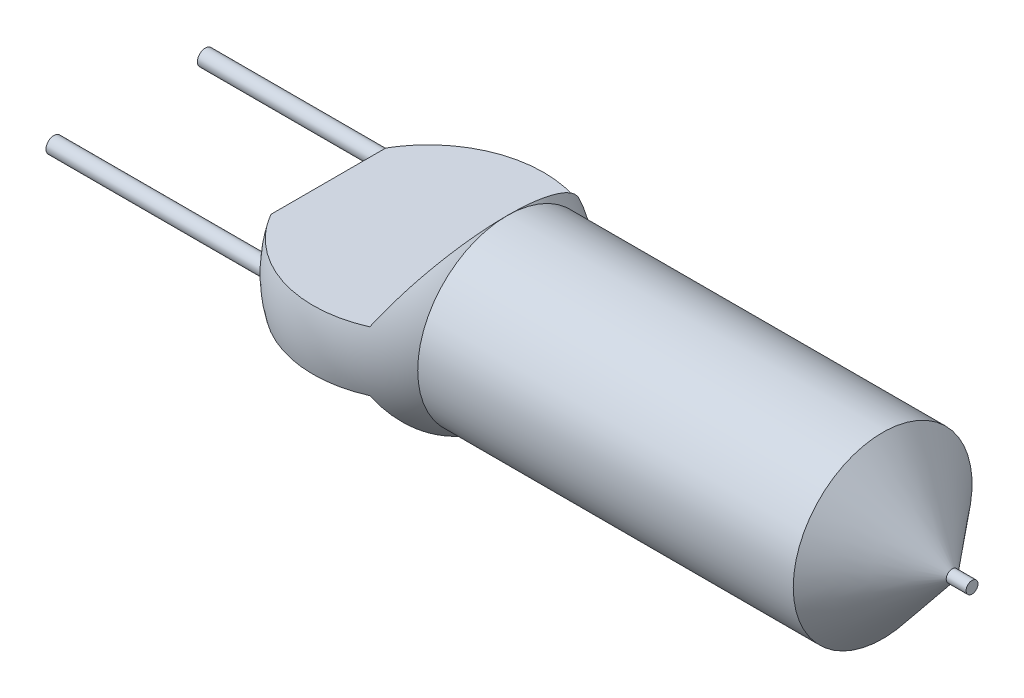
ISO-10303-21;
HEADER;
FILE_DESCRIPTION(('STEP AP214'),'2;1');
FILE_NAME('part.step','',(''),(''),'','','');
FILE_SCHEMA(('AUTOMOTIVE_DESIGN { 1 0 10303 214 1 1 1 1 }'));
ENDSEC;
DATA;
#1=APPLICATION_CONTEXT('core data for automotive mechanical design processes');
#2=APPLICATION_PROTOCOL_DEFINITION('international standard','automotive_design',2000,#1);
#3=PRODUCT_CONTEXT('',#1,'mechanical');
#4=PRODUCT('Part','Part','',(#3));
#5=PRODUCT_RELATED_PRODUCT_CATEGORY('part','',(#4));
#6=PRODUCT_DEFINITION_FORMATION('','',#4);
#7=PRODUCT_DEFINITION_CONTEXT('part definition',#1,'design');
#8=PRODUCT_DEFINITION('design','',#6,#7);
#9=PRODUCT_DEFINITION_SHAPE('','',#8);
#10=(LENGTH_UNIT() NAMED_UNIT(*) SI_UNIT(.MILLI.,.METRE.));
#11=(NAMED_UNIT(*) PLANE_ANGLE_UNIT() SI_UNIT($,.RADIAN.));
#12=(NAMED_UNIT(*) SI_UNIT($,.STERADIAN.) SOLID_ANGLE_UNIT());
#13=UNCERTAINTY_MEASURE_WITH_UNIT(LENGTH_MEASURE(1.E-05),#10,'distance_accuracy_value','');
#14=(GEOMETRIC_REPRESENTATION_CONTEXT(3) GLOBAL_UNCERTAINTY_ASSIGNED_CONTEXT((#13)) GLOBAL_UNIT_ASSIGNED_CONTEXT((#10,
#11,#12)) REPRESENTATION_CONTEXT('',''));
#15=CARTESIAN_POINT('',(0.,0.,0.));
#16=DIRECTION('',(0.,0.,1.));
#17=DIRECTION('',(1.,0.,0.));
#18=AXIS2_PLACEMENT_3D('',#15,#16,#17);
#19=CARTESIAN_POINT('',(4.,0.,3.81));
#20=DIRECTION('',(-1.,0.,0.));
#21=DIRECTION('',(0.,0.,1.));
#22=AXIS2_PLACEMENT_3D('',#19,#20,#21);
#23=CYLINDRICAL_SURFACE('',#22,0.4);
#24=CARTESIAN_POINT('',(4.,0.,3.81));
#25=DIRECTION('',(-1.,0.,0.));
#26=DIRECTION('',(0.,0.,-1.));
#27=AXIS2_PLACEMENT_3D('',#24,#25,#26);
#28=CIRCLE('',#27,0.4);
#29=CARTESIAN_POINT('',(4.,0.,3.41));
#30=VERTEX_POINT('',#29);
#31=EDGE_CURVE('E11',#30,#30,#28,.T.);
#32=ORIENTED_EDGE('',*,*,#31,.T.);
#33=EDGE_LOOP('',(#32));
#34=FACE_BOUND('',#33,.T.);
#35=CARTESIAN_POINT('',(-10.,0.,3.81));
#36=DIRECTION('',(-1.,0.,0.));
#37=DIRECTION('',(0.,0.,-1.));
#38=AXIS2_PLACEMENT_3D('',#35,#36,#37);
#39=CIRCLE('',#38,0.4);
#40=CARTESIAN_POINT('',(-10.,0.,3.41));
#41=VERTEX_POINT('',#40);
#42=EDGE_CURVE('E47',#41,#41,#39,.T.);
#43=ORIENTED_EDGE('',*,*,#42,.F.);
#44=EDGE_LOOP('',(#43));
#45=FACE_BOUND('',#44,.T.);
#46=ADVANCED_FACE('F41',(#34,#45),#23,.T.);
#47=CARTESIAN_POINT('',(4.,0.,3.81));
#48=DIRECTION('',(1.,0.,0.));
#49=DIRECTION('',(0.,0.,-1.));
#50=AXIS2_PLACEMENT_3D('',#47,#48,#49);
#51=PLANE('',#50);
#52=ORIENTED_EDGE('',*,*,#31,.F.);
#53=EDGE_LOOP('',(#52));
#54=FACE_BOUND('',#53,.T.);
#55=ADVANCED_FACE('F56',(#54),#51,.T.);
#56=CARTESIAN_POINT('',(-10.,0.,3.81));
#57=DIRECTION('',(1.,0.,0.));
#58=DIRECTION('',(0.,0.,-1.));
#59=AXIS2_PLACEMENT_3D('',#56,#57,#58);
#60=PLANE('',#59);
#61=ORIENTED_EDGE('',*,*,#42,.T.);
#62=EDGE_LOOP('',(#61));
#63=FACE_BOUND('',#62,.T.);
#64=ADVANCED_FACE('F53',(#63),#60,.F.);
#65=CLOSED_SHELL('',(#46,#55,#64));
#66=MANIFOLD_SOLID_BREP('B2',#65);
#67=CARTESIAN_POINT('',(4.,0.,-3.81));
#68=DIRECTION('',(-1.,0.,0.));
#69=DIRECTION('',(0.,0.,1.));
#70=AXIS2_PLACEMENT_3D('',#67,#68,#69);
#71=CYLINDRICAL_SURFACE('',#70,0.4);
#72=CARTESIAN_POINT('',(4.,0.,-3.81));
#73=DIRECTION('',(-1.,0.,0.));
#74=DIRECTION('',(0.,0.,1.));
#75=AXIS2_PLACEMENT_3D('',#72,#73,#74);
#76=CIRCLE('',#75,0.4);
#77=CARTESIAN_POINT('',(4.,0.,-3.41));
#78=VERTEX_POINT('',#77);
#79=EDGE_CURVE('E40',#78,#78,#76,.T.);
#80=ORIENTED_EDGE('',*,*,#79,.T.);
#81=EDGE_LOOP('',(#80));
#82=FACE_BOUND('',#81,.T.);
#83=CARTESIAN_POINT('',(-10.,0.,-3.81));
#84=DIRECTION('',(-1.,0.,0.));
#85=DIRECTION('',(0.,0.,1.));
#86=AXIS2_PLACEMENT_3D('',#83,#84,#85);
#87=CIRCLE('',#86,0.4);
#88=CARTESIAN_POINT('',(-10.,0.,-3.41));
#89=VERTEX_POINT('',#88);
#90=EDGE_CURVE('E96',#89,#89,#87,.T.);
#91=ORIENTED_EDGE('',*,*,#90,.F.);
#92=EDGE_LOOP('',(#91));
#93=FACE_BOUND('',#92,.T.);
#94=ADVANCED_FACE('F90',(#82,#93),#71,.T.);
#95=CARTESIAN_POINT('',(4.,0.,-3.81));
#96=DIRECTION('',(-1.,0.,0.));
#97=DIRECTION('',(0.,0.,1.));
#98=AXIS2_PLACEMENT_3D('',#95,#96,#97);
#99=PLANE('',#98);
#100=ORIENTED_EDGE('',*,*,#79,.F.);
#101=EDGE_LOOP('',(#100));
#102=FACE_BOUND('',#101,.T.);
#103=ADVANCED_FACE('F105',(#102),#99,.F.);
#104=CARTESIAN_POINT('',(-10.,0.,-3.81));
#105=DIRECTION('',(-1.,0.,0.));
#106=DIRECTION('',(0.,0.,1.));
#107=AXIS2_PLACEMENT_3D('',#104,#105,#106);
#108=PLANE('',#107);
#109=ORIENTED_EDGE('',*,*,#90,.T.);
#110=EDGE_LOOP('',(#109));
#111=FACE_BOUND('',#110,.T.);
#112=ADVANCED_FACE('F102',(#111),#108,.T.);
#113=CLOSED_SHELL('',(#94,#103,#112));
#114=MANIFOLD_SOLID_BREP('B6',#113);
#115=CARTESIAN_POINT('',(0.,0.,0.));
#116=DIRECTION('',(1.,0.,0.));
#117=DIRECTION('',(0.,0.,-1.));
#118=AXIS2_PLACEMENT_3D('',#115,#116,#117);
#119=PLANE('',#118);
#120=DIRECTION('',(0.,0.,-1.));
#121=VECTOR('',#120,1.);
#122=CARTESIAN_POINT('',(0.,-1.5,0.));
#123=LINE('',#122,#121);
#124=CARTESIAN_POINT('',(0.,-1.5,2.8831406486677));
#125=VERTEX_POINT('',#124);
#126=CARTESIAN_POINT('',(0.,-1.5,-2.8831406486677));
#127=VERTEX_POINT('',#126);
#128=EDGE_CURVE('E143',#125,#127,#123,.T.);
#129=ORIENTED_EDGE('',*,*,#128,.F.);
#130=CARTESIAN_POINT('',(0.,0.,0.));
#131=DIRECTION('',(-1.,0.,0.));
#132=DIRECTION('',(0.,0.,1.));
#133=AXIS2_PLACEMENT_3D('',#130,#131,#132);
#134=CIRCLE('',#133,3.25);
#135=CARTESIAN_POINT('',(0.,1.5,2.8831406486677));
#136=VERTEX_POINT('',#135);
#137=EDGE_CURVE('E199',#125,#136,#134,.T.);
#138=ORIENTED_EDGE('',*,*,#137,.T.);
#139=DIRECTION('',(0.,0.,1.));
#140=VECTOR('',#139,1.);
#141=CARTESIAN_POINT('',(0.,1.5,0.));
#142=LINE('',#141,#140);
#143=CARTESIAN_POINT('',(0.,1.5,-2.8831406486677));
#144=VERTEX_POINT('',#143);
#145=EDGE_CURVE('E216',#144,#136,#142,.T.);
#146=ORIENTED_EDGE('',*,*,#145,.F.);
#147=EDGE_CURVE('E200',#144,#127,#134,.T.);
#148=ORIENTED_EDGE('',*,*,#147,.T.);
#149=EDGE_LOOP('',(#129,#138,#146,#148));
#150=FACE_BOUND('',#149,.T.);
#151=ADVANCED_FACE('F130',(#150),#119,.F.);
#152=CARTESIAN_POINT('',(5.03819444444444,0.,0.));
#153=DIRECTION('',(-1.,0.,0.));
#154=DIRECTION('',(0.,1.,0.));
#155=AXIS2_PLACEMENT_3D('',#152,#153,#154);
#156=SPHERICAL_SURFACE('',#155,5.99549024351061);
#157=CARTESIAN_POINT('',(5.03819444444444,-1.5,0.));
#158=DIRECTION('',(0.,-1.,0.));
#159=DIRECTION('',(1.,0.,0.));
#160=AXIS2_PLACEMENT_3D('',#157,#158,#159);
#161=CIRCLE('',#160,5.80481724604925);
#162=CARTESIAN_POINT('',(7.39156576262559,-1.5,5.30636850386337));
#163=VERTEX_POINT('',#162);
#164=EDGE_CURVE('E88',#163,#125,#161,.T.);
#165=ORIENTED_EDGE('',*,*,#164,.F.);
#166=CARTESIAN_POINT('',(6.24146662548246,0.645128057620573,0.));
#167=DIRECTION('',(-0.881322004928886,-0.472516162293025,0.));
#168=DIRECTION('',(0.472516162293025,-0.881322004928886,0.));
#169=AXIS2_PLACEMENT_3D('',#166,#167,#168);
#170=CIRCLE('',#169,5.83796617904229);
#171=CARTESIAN_POINT('',(8.99999999999999,-4.5,0.));
#172=VERTEX_POINT('',#171);
#173=EDGE_CURVE('E179',#172,#163,#170,.T.);
#174=ORIENTED_EDGE('',*,*,#173,.F.);
#175=CARTESIAN_POINT('',(8.99999999999999,0.,0.));
#176=DIRECTION('',(-1.,0.,0.));
#177=DIRECTION('',(0.,0.,1.));
#178=AXIS2_PLACEMENT_3D('',#175,#176,#177);
#179=CIRCLE('',#178,4.5);
#180=CARTESIAN_POINT('',(8.99999999999999,4.5,0.));
#181=VERTEX_POINT('',#180);
#182=EDGE_CURVE('E151',#172,#181,#179,.T.);
#183=ORIENTED_EDGE('',*,*,#182,.T.);
#184=CARTESIAN_POINT('',(6.24146662548246,-0.645128057620574,0.));
#185=DIRECTION('',(-0.881322004928886,0.472516162293025,0.));
#186=DIRECTION('',(-0.472516162293025,-0.881322004928886,0.));
#187=AXIS2_PLACEMENT_3D('',#184,#185,#186);
#188=CIRCLE('',#187,5.83796617904229);
#189=CARTESIAN_POINT('',(7.39156576262559,1.5,5.30636850386337));
#190=VERTEX_POINT('',#189);
#191=EDGE_CURVE('E218',#190,#181,#188,.T.);
#192=ORIENTED_EDGE('',*,*,#191,.F.);
#193=CARTESIAN_POINT('',(5.03819444444444,1.5,0.));
#194=DIRECTION('',(0.,1.,0.));
#195=DIRECTION('',(-1.,0.,0.));
#196=AXIS2_PLACEMENT_3D('',#193,#194,#195);
#197=CIRCLE('',#196,5.80481724604925);
#198=EDGE_CURVE('E206',#136,#190,#197,.T.);
#199=ORIENTED_EDGE('',*,*,#198,.F.);
#200=ORIENTED_EDGE('',*,*,#137,.F.);
#201=EDGE_LOOP('',(#165,#174,#183,#192,#199,#200));
#202=FACE_BOUND('',#201,.T.);
#203=ADVANCED_FACE('F186',(#202),#156,.T.);
#204=CARTESIAN_POINT('',(7.39156576262559,-1.5,-5.30636850386337));
#205=VERTEX_POINT('',#204);
#206=EDGE_CURVE('E177',#205,#172,#170,.T.);
#207=ORIENTED_EDGE('',*,*,#206,.F.);
#208=EDGE_CURVE('E133',#127,#205,#161,.T.);
#209=ORIENTED_EDGE('',*,*,#208,.F.);
#210=ORIENTED_EDGE('',*,*,#147,.F.);
#211=CARTESIAN_POINT('',(7.39156576262559,1.5,-5.30636850386337));
#212=VERTEX_POINT('',#211);
#213=EDGE_CURVE('E205',#212,#144,#197,.T.);
#214=ORIENTED_EDGE('',*,*,#213,.F.);
#215=EDGE_CURVE('E198',#181,#212,#188,.T.);
#216=ORIENTED_EDGE('',*,*,#215,.F.);
#217=EDGE_CURVE('E192',#181,#172,#179,.T.);
#218=ORIENTED_EDGE('',*,*,#217,.T.);
#219=EDGE_LOOP('',(#207,#209,#210,#214,#216,#218));
#220=FACE_BOUND('',#219,.T.);
#221=ADVANCED_FACE('F196',(#220),#156,.T.);
#222=CARTESIAN_POINT('',(-53.4381049069374,0.,0.));
#223=DIRECTION('',(-1.,0.,0.));
#224=DIRECTION('',(0.,0.,1.));
#225=AXIS2_PLACEMENT_3D('',#222,#223,#224);
#226=CYLINDRICAL_SURFACE('',#225,4.5);
#227=ORIENTED_EDGE('',*,*,#217,.F.);
#228=ORIENTED_EDGE('',*,*,#182,.F.);
#229=EDGE_LOOP('',(#227,#228));
#230=FACE_BOUND('',#229,.T.);
#231=CARTESIAN_POINT('',(27.9,0.,0.));
#232=DIRECTION('',(-1.,0.,0.));
#233=DIRECTION('',(0.,0.,1.));
#234=AXIS2_PLACEMENT_3D('',#231,#232,#233);
#235=CIRCLE('',#234,4.5);
#236=CARTESIAN_POINT('',(27.9,0.,4.5));
#237=VERTEX_POINT('',#236);
#238=EDGE_CURVE('E193',#237,#237,#235,.T.);
#239=ORIENTED_EDGE('',*,*,#238,.T.);
#240=EDGE_LOOP('',(#239));
#241=FACE_BOUND('',#240,.T.);
#242=ADVANCED_FACE('F190',(#230,#241),#226,.T.);
#243=CARTESIAN_POINT('',(31.4,0.,0.));
#244=DIRECTION('',(-1.,0.,0.));
#245=DIRECTION('',(0.,0.,1.));
#246=AXIS2_PLACEMENT_3D('',#243,#244,#245);
#247=CONICAL_SURFACE('',#246,0.3,0.876058050598193);
#248=CARTESIAN_POINT('',(31.4,0.,0.));
#249=DIRECTION('',(-1.,0.,0.));
#250=DIRECTION('',(0.,0.,1.));
#251=AXIS2_PLACEMENT_3D('',#248,#249,#250);
#252=CIRCLE('',#251,0.3);
#253=CARTESIAN_POINT('',(31.4,0.,0.299999999999996));
#254=VERTEX_POINT('',#253);
#255=EDGE_CURVE('E221',#254,#254,#252,.T.);
#256=CARTESIAN_POINT('',(27.9,0.,4.5));
#257=CARTESIAN_POINT('',(27.9364583333333,0.,4.45625));
#258=CARTESIAN_POINT('',(27.9729166666667,0.,4.4125));
#259=CARTESIAN_POINT('',(28.0458333333333,0.,4.325));
#260=CARTESIAN_POINT('',(28.0822916666667,0.,4.28125));
#261=CARTESIAN_POINT('',(28.1552083333333,0.,4.19375));
#262=CARTESIAN_POINT('',(28.1916666666667,0.,4.15));
#263=CARTESIAN_POINT('',(28.2645833333333,0.,4.0625));
#264=CARTESIAN_POINT('',(28.3010416666667,0.,4.01875));
#265=CARTESIAN_POINT('',(28.3739583333333,0.,3.93125));
#266=CARTESIAN_POINT('',(28.4104166666667,0.,3.8875));
#267=CARTESIAN_POINT('',(28.4833333333333,0.,3.8));
#268=CARTESIAN_POINT('',(28.5197916666667,0.,3.75625));
#269=CARTESIAN_POINT('',(28.5927083333333,0.,3.66875));
#270=CARTESIAN_POINT('',(28.6291666666667,0.,3.625));
#271=CARTESIAN_POINT('',(28.7020833333333,0.,3.5375));
#272=CARTESIAN_POINT('',(28.7385416666667,0.,3.49375));
#273=CARTESIAN_POINT('',(28.8114583333333,0.,3.40625));
#274=CARTESIAN_POINT('',(28.8479166666667,0.,3.3625));
#275=CARTESIAN_POINT('',(28.9208333333333,0.,3.275));
#276=CARTESIAN_POINT('',(28.9572916666667,0.,3.23125));
#277=CARTESIAN_POINT('',(29.0302083333333,0.,3.14375));
#278=CARTESIAN_POINT('',(29.0666666666667,0.,3.1));
#279=CARTESIAN_POINT('',(29.1395833333333,0.,3.0125));
#280=CARTESIAN_POINT('',(29.1760416666667,0.,2.96875));
#281=CARTESIAN_POINT('',(29.2489583333333,0.,2.88125));
#282=CARTESIAN_POINT('',(29.2854166666667,0.,2.8375));
#283=CARTESIAN_POINT('',(29.3583333333333,0.,2.75));
#284=CARTESIAN_POINT('',(29.3947916666667,0.,2.70625));
#285=CARTESIAN_POINT('',(29.4677083333333,0.,2.61875));
#286=CARTESIAN_POINT('',(29.5041666666667,0.,2.575));
#287=CARTESIAN_POINT('',(29.5770833333333,0.,2.4875));
#288=CARTESIAN_POINT('',(29.6135416666667,0.,2.44375));
#289=CARTESIAN_POINT('',(29.6864583333333,0.,2.35625));
#290=CARTESIAN_POINT('',(29.7229166666667,0.,2.3125));
#291=CARTESIAN_POINT('',(29.7958333333333,0.,2.225));
#292=CARTESIAN_POINT('',(29.8322916666667,0.,2.18125));
#293=CARTESIAN_POINT('',(29.9052083333333,0.,2.09375));
#294=CARTESIAN_POINT('',(29.9416666666667,0.,2.05));
#295=CARTESIAN_POINT('',(30.0145833333333,0.,1.9625));
#296=CARTESIAN_POINT('',(30.0510416666667,0.,1.91875));
#297=CARTESIAN_POINT('',(30.1239583333333,0.,1.83125));
#298=CARTESIAN_POINT('',(30.1604166666667,0.,1.7875));
#299=CARTESIAN_POINT('',(30.2333333333333,0.,1.7));
#300=CARTESIAN_POINT('',(30.2697916666667,0.,1.65625));
#301=CARTESIAN_POINT('',(30.3427083333333,0.,1.56875));
#302=CARTESIAN_POINT('',(30.3791666666667,0.,1.525));
#303=CARTESIAN_POINT('',(30.4520833333333,0.,1.4375));
#304=CARTESIAN_POINT('',(30.4885416666667,0.,1.39375));
#305=CARTESIAN_POINT('',(30.5614583333333,0.,1.30625));
#306=CARTESIAN_POINT('',(30.5979166666667,0.,1.2625));
#307=CARTESIAN_POINT('',(30.6708333333333,0.,1.175));
#308=CARTESIAN_POINT('',(30.7072916666667,0.,1.13125));
#309=CARTESIAN_POINT('',(30.7802083333333,0.,1.04375));
#310=CARTESIAN_POINT('',(30.8166666666667,0.,0.999999999999996));
#311=CARTESIAN_POINT('',(30.8895833333333,0.,0.912499999999996));
#312=CARTESIAN_POINT('',(30.9260416666667,0.,0.868749999999996));
#313=CARTESIAN_POINT('',(30.9989583333333,0.,0.781249999999996));
#314=CARTESIAN_POINT('',(31.0354166666667,0.,0.737499999999996));
#315=CARTESIAN_POINT('',(31.1083333333333,0.,0.649999999999995));
#316=CARTESIAN_POINT('',(31.1447916666667,0.,0.606249999999996));
#317=CARTESIAN_POINT('',(31.2177083333333,0.,0.518749999999996));
#318=CARTESIAN_POINT('',(31.2541666666667,0.,0.474999999999996));
#319=CARTESIAN_POINT('',(31.3270833333333,0.,0.387499999999997));
#320=CARTESIAN_POINT('',(31.3635416666667,0.,0.343749999999997));
#321=CARTESIAN_POINT('',(31.4,0.,0.299999999999996));
#322=B_SPLINE_CURVE_WITH_KNOTS('',3,(#256,#257,#258,#259,#260,#261,#262,#263,#264,#265,#266,
#267,#268,#269,#270,#271,#272,#273,#274,#275,#276,#277,#278,#279,#280,#281,#282,#283,#284,#285,
#286,#287,#288,#289,#290,#291,#292,#293,#294,#295,#296,#297,#298,#299,#300,#301,#302,#303,#304,
#305,#306,#307,#308,#309,#310,#311,#312,#313,#314,#315,#316,#317,#318,#319,#320,#321),
.UNSPECIFIED.,.F.,.F.,(4,2,2,2,2,2,2,2,2,2,2,2,2,2,2,2,2,2,2,2,2,2,2,2,2,2,2,2,2,2,2,2,4),(0.,
0.170849211660459,0.341698423320919,0.512547634981376,0.683396846641833,0.854246058302292,
1.02509526996275,1.19594448162321,1.36679369328367,1.53764290494412,1.70849211660458,
1.87934132826504,2.0501905399255,2.22103975158596,2.39188896324642,2.56273817490687,
2.73358738656733,2.90443659822779,3.07528580988825,3.24613502154871,3.41698423320917,
3.58783344486962,3.75868265653008,3.92953186819054,4.100381079851,4.27123029151146,
4.44207950317191,4.61292871483237,4.78377792649283,4.95462713815329,5.12547634981375,
5.29632556147421,5.46717477313466),.UNSPECIFIED.);
#323=EDGE_CURVE('BSEAM231',#237,#254,#322,.T.);
#324=ORIENTED_EDGE('',*,*,#238,.F.);
#325=ORIENTED_EDGE('',*,*,#255,.T.);
#326=ORIENTED_EDGE('',*,*,#323,.T.);
#327=ORIENTED_EDGE('',*,*,#323,.F.);
#328=EDGE_LOOP('',(#324,#326,#325,#327));
#329=FACE_BOUND('',#328,.T.);
#330=ADVANCED_FACE('F231',(#329),#247,.T.);
#331=CARTESIAN_POINT('',(-53.4381049069374,0.,0.));
#332=DIRECTION('',(-1.,0.,0.));
#333=DIRECTION('',(0.,0.,1.));
#334=AXIS2_PLACEMENT_3D('',#331,#332,#333);
#335=CYLINDRICAL_SURFACE('',#334,0.3);
#336=ORIENTED_EDGE('',*,*,#255,.F.);
#337=EDGE_LOOP('',(#336));
#338=FACE_BOUND('',#337,.T.);
#339=CARTESIAN_POINT('',(32.4,0.,0.));
#340=DIRECTION('',(-1.,0.,0.));
#341=DIRECTION('',(0.,0.,1.));
#342=AXIS2_PLACEMENT_3D('',#339,#340,#341);
#343=CIRCLE('',#342,0.3);
#344=CARTESIAN_POINT('',(32.4,0.,0.3));
#345=VERTEX_POINT('',#344);
#346=EDGE_CURVE('E217',#345,#345,#343,.T.);
#347=ORIENTED_EDGE('',*,*,#346,.T.);
#348=EDGE_LOOP('',(#347));
#349=FACE_BOUND('',#348,.T.);
#350=ADVANCED_FACE('F233',(#338,#349),#335,.T.);
#351=CARTESIAN_POINT('',(32.4,0.3,0.));
#352=DIRECTION('',(-1.,0.,0.));
#353=DIRECTION('',(0.,0.,1.));
#354=AXIS2_PLACEMENT_3D('',#351,#352,#353);
#355=PLANE('',#354);
#356=ORIENTED_EDGE('',*,*,#346,.F.);
#357=EDGE_LOOP('',(#356));
#358=FACE_BOUND('',#357,.T.);
#359=ADVANCED_FACE('F239',(#358),#355,.F.);
#360=CARTESIAN_POINT('',(7.39156576262559,1.5,10.));
#361=DIRECTION('',(0.,1.,0.));
#362=DIRECTION('',(-1.,0.,0.));
#363=AXIS2_PLACEMENT_3D('',#360,#361,#362);
#364=PLANE('',#363);
#365=ORIENTED_EDGE('',*,*,#198,.T.);
#366=DIRECTION('',(0.,0.,-1.));
#367=VECTOR('',#366,1.);
#368=CARTESIAN_POINT('',(7.39156576262559,1.5,10.));
#369=LINE('',#368,#367);
#370=EDGE_CURVE('E326',#190,#212,#369,.T.);
#371=ORIENTED_EDGE('',*,*,#370,.T.);
#372=ORIENTED_EDGE('',*,*,#213,.T.);
#373=ORIENTED_EDGE('',*,*,#145,.T.);
#374=EDGE_LOOP('',(#365,#371,#372,#373));
#375=FACE_BOUND('',#374,.T.);
#376=ADVANCED_FACE('F262',(#375),#364,.T.);
#377=CARTESIAN_POINT('',(9.,4.5,10.));
#378=DIRECTION('',(-0.881322004928886,0.472516162293025,0.));
#379=DIRECTION('',(-0.472516162293025,-0.881322004928886,0.));
#380=AXIS2_PLACEMENT_3D('',#377,#378,#379);
#381=PLANE('',#380);
#382=ORIENTED_EDGE('',*,*,#191,.T.);
#383=ORIENTED_EDGE('',*,*,#215,.T.);
#384=ORIENTED_EDGE('',*,*,#370,.F.);
#385=EDGE_LOOP('',(#382,#383,#384));
#386=FACE_BOUND('',#385,.T.);
#387=ADVANCED_FACE('F267',(#386),#381,.T.);
#388=CARTESIAN_POINT('',(7.39156576262559,-1.5,10.));
#389=DIRECTION('',(0.,-1.,0.));
#390=DIRECTION('',(1.,0.,0.));
#391=AXIS2_PLACEMENT_3D('',#388,#389,#390);
#392=PLANE('',#391);
#393=ORIENTED_EDGE('',*,*,#164,.T.);
#394=ORIENTED_EDGE('',*,*,#128,.T.);
#395=ORIENTED_EDGE('',*,*,#208,.T.);
#396=DIRECTION('',(0.,0.,-1.));
#397=VECTOR('',#396,1.);
#398=CARTESIAN_POINT('',(7.39156576262559,-1.5,10.));
#399=LINE('',#398,#397);
#400=EDGE_CURVE('E181',#163,#205,#399,.T.);
#401=ORIENTED_EDGE('',*,*,#400,.F.);
#402=EDGE_LOOP('',(#393,#394,#395,#401));
#403=FACE_BOUND('',#402,.T.);
#404=ADVANCED_FACE('F213',(#403),#392,.T.);
#405=CARTESIAN_POINT('',(9.,-4.5,10.));
#406=DIRECTION('',(-0.881322004928886,-0.472516162293025,0.));
#407=DIRECTION('',(0.472516162293025,-0.881322004928886,0.));
#408=AXIS2_PLACEMENT_3D('',#405,#406,#407);
#409=PLANE('',#408);
#410=ORIENTED_EDGE('',*,*,#173,.T.);
#411=ORIENTED_EDGE('',*,*,#400,.T.);
#412=ORIENTED_EDGE('',*,*,#206,.T.);
#413=EDGE_LOOP('',(#410,#411,#412));
#414=FACE_BOUND('',#413,.T.);
#415=ADVANCED_FACE('F178',(#414),#409,.T.);
#416=CLOSED_SHELL('',(#151,#203,#221,#242,#330,#350,#359,#376,#387,#404,#415));
#417=MANIFOLD_SOLID_BREP('B35',#416);
#418=ADVANCED_BREP_SHAPE_REPRESENTATION('',(#18,#66,#114,#417),#14);
#419=SHAPE_DEFINITION_REPRESENTATION(#9,#418);
ENDSEC;
END-ISO-10303-21;
